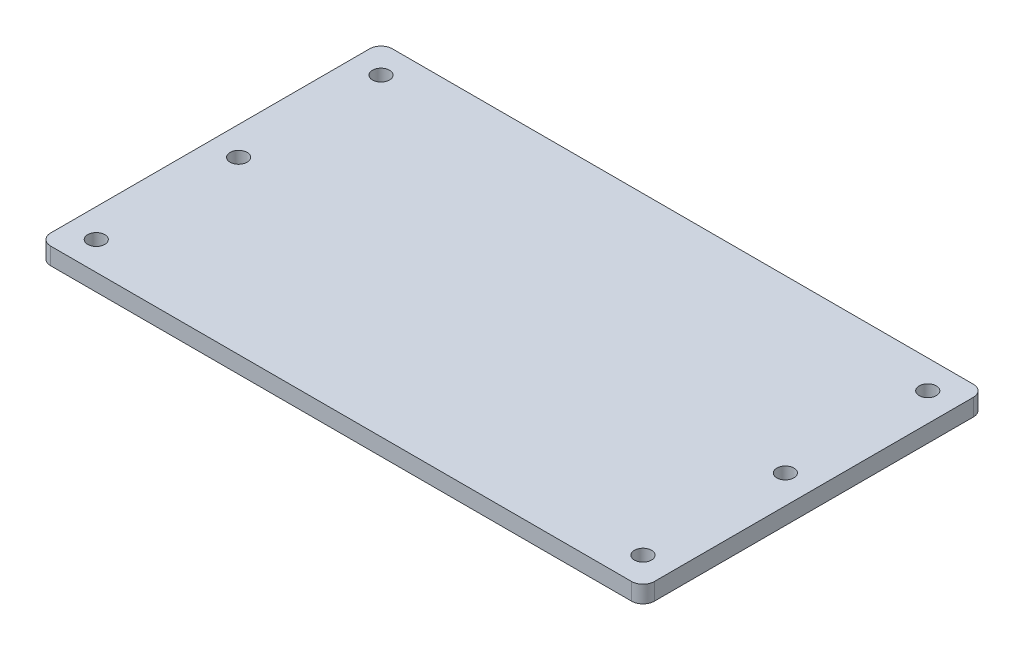
ISO-10303-21;
HEADER;
FILE_DESCRIPTION(('STEP AP214'),'2;1');
FILE_NAME('part.step','',(''),(''),'','','');
FILE_SCHEMA(('AUTOMOTIVE_DESIGN { 1 0 10303 214 1 1 1 1 }'));
ENDSEC;
DATA;
#1=APPLICATION_CONTEXT('core data for automotive mechanical design processes');
#2=APPLICATION_PROTOCOL_DEFINITION('international standard','automotive_design',2000,#1);
#3=PRODUCT_CONTEXT('',#1,'mechanical');
#4=PRODUCT('Part','Part','',(#3));
#5=PRODUCT_RELATED_PRODUCT_CATEGORY('part','',(#4));
#6=PRODUCT_DEFINITION_FORMATION('','',#4);
#7=PRODUCT_DEFINITION_CONTEXT('part definition',#1,'design');
#8=PRODUCT_DEFINITION('design','',#6,#7);
#9=PRODUCT_DEFINITION_SHAPE('','',#8);
#10=(LENGTH_UNIT() NAMED_UNIT(*) SI_UNIT(.MILLI.,.METRE.));
#11=(NAMED_UNIT(*) PLANE_ANGLE_UNIT() SI_UNIT($,.RADIAN.));
#12=(NAMED_UNIT(*) SI_UNIT($,.STERADIAN.) SOLID_ANGLE_UNIT());
#13=UNCERTAINTY_MEASURE_WITH_UNIT(LENGTH_MEASURE(1.E-05),#10,'distance_accuracy_value','');
#14=(GEOMETRIC_REPRESENTATION_CONTEXT(3) GLOBAL_UNCERTAINTY_ASSIGNED_CONTEXT((#13)) GLOBAL_UNIT_ASSIGNED_CONTEXT((#10,
#11,#12)) REPRESENTATION_CONTEXT('',''));
#15=CARTESIAN_POINT('',(0.,0.,0.));
#16=DIRECTION('',(0.,0.,1.));
#17=DIRECTION('',(1.,0.,0.));
#18=AXIS2_PLACEMENT_3D('',#15,#16,#17);
#19=CARTESIAN_POINT('',(53.,3.,-30.));
#20=DIRECTION('',(-1.,0.,0.));
#21=DIRECTION('',(0.,0.,1.));
#22=AXIS2_PLACEMENT_3D('',#19,#20,#21);
#23=PLANE('',#22);
#24=DIRECTION('',(0.,0.,-1.));
#25=VECTOR('',#24,1.);
#26=CARTESIAN_POINT('',(53.,3.,-30.));
#27=LINE('',#26,#25);
#28=CARTESIAN_POINT('',(53.,3.,28.));
#29=VERTEX_POINT('',#28);
#30=CARTESIAN_POINT('',(53.,3.,-28.));
#31=VERTEX_POINT('',#30);
#32=EDGE_CURVE('E134',#29,#31,#27,.T.);
#33=ORIENTED_EDGE('',*,*,#32,.F.);
#34=DIRECTION('',(0.,-1.,0.));
#35=VECTOR('',#34,1.);
#36=CARTESIAN_POINT('',(53.,3.,28.));
#37=LINE('',#36,#35);
#38=CARTESIAN_POINT('',(53.,0.,28.));
#39=VERTEX_POINT('',#38);
#40=EDGE_CURVE('E117',#29,#39,#37,.T.);
#41=ORIENTED_EDGE('',*,*,#40,.T.);
#42=DIRECTION('',(0.,0.,-1.));
#43=VECTOR('',#42,1.);
#44=CARTESIAN_POINT('',(53.,0.,-30.));
#45=LINE('',#44,#43);
#46=CARTESIAN_POINT('',(53.,0.,-28.));
#47=VERTEX_POINT('',#46);
#48=EDGE_CURVE('E128',#39,#47,#45,.T.);
#49=ORIENTED_EDGE('',*,*,#48,.T.);
#50=DIRECTION('',(0.,-1.,0.));
#51=VECTOR('',#50,1.);
#52=CARTESIAN_POINT('',(53.,3.,-28.));
#53=LINE('',#52,#51);
#54=EDGE_CURVE('E136',#47,#31,#53,.F.);
#55=ORIENTED_EDGE('',*,*,#54,.T.);
#56=EDGE_LOOP('',(#33,#41,#49,#55));
#57=FACE_BOUND('',#56,.T.);
#58=ADVANCED_FACE('F44',(#57),#23,.F.);
#59=CARTESIAN_POINT('',(-53.,3.,-30.));
#60=DIRECTION('',(0.,0.,1.));
#61=DIRECTION('',(1.,0.,0.));
#62=AXIS2_PLACEMENT_3D('',#59,#60,#61);
#63=PLANE('',#62);
#64=DIRECTION('',(-1.,0.,0.));
#65=VECTOR('',#64,1.);
#66=CARTESIAN_POINT('',(-53.,3.,-30.));
#67=LINE('',#66,#65);
#68=CARTESIAN_POINT('',(51.,3.,-30.));
#69=VERTEX_POINT('',#68);
#70=CARTESIAN_POINT('',(-51.,3.,-30.));
#71=VERTEX_POINT('',#70);
#72=EDGE_CURVE('E216',#69,#71,#67,.T.);
#73=ORIENTED_EDGE('',*,*,#72,.F.);
#74=DIRECTION('',(0.,-1.,0.));
#75=VECTOR('',#74,1.);
#76=CARTESIAN_POINT('',(51.,3.,-30.));
#77=LINE('',#76,#75);
#78=CARTESIAN_POINT('',(51.,0.,-30.));
#79=VERTEX_POINT('',#78);
#80=EDGE_CURVE('E11',#69,#79,#77,.T.);
#81=ORIENTED_EDGE('',*,*,#80,.T.);
#82=DIRECTION('',(-1.,0.,0.));
#83=VECTOR('',#82,1.);
#84=CARTESIAN_POINT('',(-53.,0.,-30.));
#85=LINE('',#84,#83);
#86=CARTESIAN_POINT('',(-51.,0.,-30.));
#87=VERTEX_POINT('',#86);
#88=EDGE_CURVE('E142',#79,#87,#85,.T.);
#89=ORIENTED_EDGE('',*,*,#88,.T.);
#90=DIRECTION('',(0.,-1.,0.));
#91=VECTOR('',#90,1.);
#92=CARTESIAN_POINT('',(-51.,3.,-30.));
#93=LINE('',#92,#91);
#94=EDGE_CURVE('E53',#87,#71,#93,.F.);
#95=ORIENTED_EDGE('',*,*,#94,.T.);
#96=EDGE_LOOP('',(#73,#81,#89,#95));
#97=FACE_BOUND('',#96,.T.);
#98=ADVANCED_FACE('F214',(#97),#63,.F.);
#99=CARTESIAN_POINT('',(-53.,3.,-30.));
#100=DIRECTION('',(1.,0.,0.));
#101=DIRECTION('',(0.,0.,-1.));
#102=AXIS2_PLACEMENT_3D('',#99,#100,#101);
#103=PLANE('',#102);
#104=DIRECTION('',(0.,0.,1.));
#105=VECTOR('',#104,1.);
#106=CARTESIAN_POINT('',(-53.,0.,-30.));
#107=LINE('',#106,#105);
#108=CARTESIAN_POINT('',(-53.,0.,-28.));
#109=VERTEX_POINT('',#108);
#110=CARTESIAN_POINT('',(-53.,0.,28.));
#111=VERTEX_POINT('',#110);
#112=EDGE_CURVE('E146',#109,#111,#107,.T.);
#113=ORIENTED_EDGE('',*,*,#112,.T.);
#114=DIRECTION('',(0.,-1.,0.));
#115=VECTOR('',#114,1.);
#116=CARTESIAN_POINT('',(-53.,3.,28.));
#117=LINE('',#116,#115);
#118=CARTESIAN_POINT('',(-53.,3.,28.));
#119=VERTEX_POINT('',#118);
#120=EDGE_CURVE('E61',#111,#119,#117,.F.);
#121=ORIENTED_EDGE('',*,*,#120,.T.);
#122=DIRECTION('',(0.,0.,1.));
#123=VECTOR('',#122,1.);
#124=CARTESIAN_POINT('',(-53.,3.,-30.));
#125=LINE('',#124,#123);
#126=CARTESIAN_POINT('',(-53.,3.,-28.));
#127=VERTEX_POINT('',#126);
#128=EDGE_CURVE('E224',#127,#119,#125,.T.);
#129=ORIENTED_EDGE('',*,*,#128,.F.);
#130=DIRECTION('',(0.,-1.,0.));
#131=VECTOR('',#130,1.);
#132=CARTESIAN_POINT('',(-53.,3.,-28.));
#133=LINE('',#132,#131);
#134=EDGE_CURVE('E210',#127,#109,#133,.T.);
#135=ORIENTED_EDGE('',*,*,#134,.T.);
#136=EDGE_LOOP('',(#113,#121,#129,#135));
#137=FACE_BOUND('',#136,.T.);
#138=ADVANCED_FACE('F227',(#137),#103,.F.);
#139=CARTESIAN_POINT('',(-53.,3.,30.));
#140=DIRECTION('',(0.,0.,-1.));
#141=DIRECTION('',(-1.,0.,0.));
#142=AXIS2_PLACEMENT_3D('',#139,#140,#141);
#143=PLANE('',#142);
#144=DIRECTION('',(1.,0.,0.));
#145=VECTOR('',#144,1.);
#146=CARTESIAN_POINT('',(-53.,0.,30.));
#147=LINE('',#146,#145);
#148=CARTESIAN_POINT('',(-51.,0.,30.));
#149=VERTEX_POINT('',#148);
#150=CARTESIAN_POINT('',(51.,0.,30.));
#151=VERTEX_POINT('',#150);
#152=EDGE_CURVE('E159',#149,#151,#147,.T.);
#153=ORIENTED_EDGE('',*,*,#152,.T.);
#154=DIRECTION('',(0.,-1.,0.));
#155=VECTOR('',#154,1.);
#156=CARTESIAN_POINT('',(51.,3.,30.));
#157=LINE('',#156,#155);
#158=CARTESIAN_POINT('',(51.,3.,30.));
#159=VERTEX_POINT('',#158);
#160=EDGE_CURVE('E119',#151,#159,#157,.F.);
#161=ORIENTED_EDGE('',*,*,#160,.T.);
#162=DIRECTION('',(1.,0.,0.));
#163=VECTOR('',#162,1.);
#164=CARTESIAN_POINT('',(-53.,3.,30.));
#165=LINE('',#164,#163);
#166=CARTESIAN_POINT('',(-51.,3.,30.));
#167=VERTEX_POINT('',#166);
#168=EDGE_CURVE('E154',#167,#159,#165,.T.);
#169=ORIENTED_EDGE('',*,*,#168,.F.);
#170=DIRECTION('',(0.,-1.,0.));
#171=VECTOR('',#170,1.);
#172=CARTESIAN_POINT('',(-51.,3.,30.));
#173=LINE('',#172,#171);
#174=EDGE_CURVE('E123',#167,#149,#173,.T.);
#175=ORIENTED_EDGE('',*,*,#174,.T.);
#176=EDGE_LOOP('',(#153,#161,#169,#175));
#177=FACE_BOUND('',#176,.T.);
#178=ADVANCED_FACE('F233',(#177),#143,.F.);
#179=CARTESIAN_POINT('',(0.,3.,0.));
#180=DIRECTION('',(0.,1.,0.));
#181=DIRECTION('',(0.,0.,1.));
#182=AXIS2_PLACEMENT_3D('',#179,#180,#181);
#183=PLANE('',#182);
#184=CARTESIAN_POINT('',(48.,3.,-25.));
#185=DIRECTION('',(0.,1.,0.));
#186=DIRECTION('',(0.,0.,-1.));
#187=AXIS2_PLACEMENT_3D('',#184,#185,#186);
#188=CIRCLE('',#187,1.5);
#189=CARTESIAN_POINT('',(48.,3.,-26.5));
#190=VERTEX_POINT('',#189);
#191=EDGE_CURVE('E245',#190,#190,#188,.T.);
#192=ORIENTED_EDGE('',*,*,#191,.F.);
#193=EDGE_LOOP('',(#192));
#194=FACE_BOUND('',#193,.T.);
#195=CARTESIAN_POINT('',(48.,3.,0.));
#196=DIRECTION('',(0.,1.,0.));
#197=DIRECTION('',(0.,0.,-1.));
#198=AXIS2_PLACEMENT_3D('',#195,#196,#197);
#199=CIRCLE('',#198,1.5);
#200=CARTESIAN_POINT('',(48.,3.,-1.49999999999998));
#201=VERTEX_POINT('',#200);
#202=EDGE_CURVE('E249',#201,#201,#199,.T.);
#203=ORIENTED_EDGE('',*,*,#202,.F.);
#204=EDGE_LOOP('',(#203));
#205=FACE_BOUND('',#204,.T.);
#206=CARTESIAN_POINT('',(48.,3.,25.));
#207=DIRECTION('',(0.,1.,0.));
#208=DIRECTION('',(0.,0.,-1.));
#209=AXIS2_PLACEMENT_3D('',#206,#207,#208);
#210=CIRCLE('',#209,1.50000000000002);
#211=CARTESIAN_POINT('',(48.,3.,23.5));
#212=VERTEX_POINT('',#211);
#213=EDGE_CURVE('E252',#212,#212,#210,.T.);
#214=ORIENTED_EDGE('',*,*,#213,.F.);
#215=EDGE_LOOP('',(#214));
#216=FACE_BOUND('',#215,.T.);
#217=CARTESIAN_POINT('',(-48.,3.,25.));
#218=DIRECTION('',(0.,1.,0.));
#219=DIRECTION('',(0.,0.,1.));
#220=AXIS2_PLACEMENT_3D('',#217,#218,#219);
#221=CIRCLE('',#220,1.5);
#222=CARTESIAN_POINT('',(-48.,3.,26.5));
#223=VERTEX_POINT('',#222);
#224=EDGE_CURVE('E258',#223,#223,#221,.T.);
#225=ORIENTED_EDGE('',*,*,#224,.F.);
#226=EDGE_LOOP('',(#225));
#227=FACE_BOUND('',#226,.T.);
#228=CARTESIAN_POINT('',(-48.,3.,0.));
#229=DIRECTION('',(0.,1.,0.));
#230=DIRECTION('',(0.,0.,1.));
#231=AXIS2_PLACEMENT_3D('',#228,#229,#230);
#232=CIRCLE('',#231,1.5);
#233=CARTESIAN_POINT('',(-48.,3.,1.5));
#234=VERTEX_POINT('',#233);
#235=EDGE_CURVE('E243',#234,#234,#232,.T.);
#236=ORIENTED_EDGE('',*,*,#235,.F.);
#237=EDGE_LOOP('',(#236));
#238=FACE_BOUND('',#237,.T.);
#239=CARTESIAN_POINT('',(-48.,3.,-25.));
#240=DIRECTION('',(0.,1.,0.));
#241=DIRECTION('',(0.,0.,1.));
#242=AXIS2_PLACEMENT_3D('',#239,#240,#241);
#243=CIRCLE('',#242,1.5);
#244=CARTESIAN_POINT('',(-48.,3.,-23.5));
#245=VERTEX_POINT('',#244);
#246=EDGE_CURVE('E169',#245,#245,#243,.T.);
#247=ORIENTED_EDGE('',*,*,#246,.F.);
#248=EDGE_LOOP('',(#247));
#249=FACE_BOUND('',#248,.T.);
#250=ORIENTED_EDGE('',*,*,#168,.T.);
#251=CARTESIAN_POINT('',(51.,3.,28.));
#252=DIRECTION('',(0.,1.,0.));
#253=DIRECTION('',(0.,0.,1.));
#254=AXIS2_PLACEMENT_3D('',#251,#252,#253);
#255=CIRCLE('',#254,2.);
#256=EDGE_CURVE('E204',#159,#29,#255,.T.);
#257=ORIENTED_EDGE('',*,*,#256,.T.);
#258=ORIENTED_EDGE('',*,*,#32,.T.);
#259=CARTESIAN_POINT('',(51.,3.,-28.));
#260=DIRECTION('',(0.,1.,0.));
#261=DIRECTION('',(0.,0.,1.));
#262=AXIS2_PLACEMENT_3D('',#259,#260,#261);
#263=CIRCLE('',#262,2.);
#264=EDGE_CURVE('E196',#31,#69,#263,.T.);
#265=ORIENTED_EDGE('',*,*,#264,.T.);
#266=ORIENTED_EDGE('',*,*,#72,.T.);
#267=CARTESIAN_POINT('',(-51.,3.,-28.));
#268=DIRECTION('',(0.,1.,0.));
#269=DIRECTION('',(0.,0.,1.));
#270=AXIS2_PLACEMENT_3D('',#267,#268,#269);
#271=CIRCLE('',#270,2.);
#272=EDGE_CURVE('E69',#71,#127,#271,.T.);
#273=ORIENTED_EDGE('',*,*,#272,.T.);
#274=ORIENTED_EDGE('',*,*,#128,.T.);
#275=CARTESIAN_POINT('',(-51.,3.,28.));
#276=DIRECTION('',(0.,1.,0.));
#277=DIRECTION('',(0.,0.,1.));
#278=AXIS2_PLACEMENT_3D('',#275,#276,#277);
#279=CIRCLE('',#278,2.);
#280=EDGE_CURVE('E203',#119,#167,#279,.T.);
#281=ORIENTED_EDGE('',*,*,#280,.T.);
#282=EDGE_LOOP('',(#250,#257,#258,#265,#266,#273,#274,#281));
#283=FACE_BOUND('',#282,.T.);
#284=ADVANCED_FACE('F219',(#194,#205,#216,#227,#238,#249,#283),#183,.T.);
#285=CARTESIAN_POINT('',(0.,0.,0.));
#286=DIRECTION('',(0.,1.,0.));
#287=DIRECTION('',(0.,0.,1.));
#288=AXIS2_PLACEMENT_3D('',#285,#286,#287);
#289=PLANE('',#288);
#290=CARTESIAN_POINT('',(48.,0.,-25.));
#291=DIRECTION('',(0.,1.,0.));
#292=DIRECTION('',(0.,0.,1.));
#293=AXIS2_PLACEMENT_3D('',#290,#291,#292);
#294=CIRCLE('',#293,1.5);
#295=CARTESIAN_POINT('',(48.,0.,-23.5));
#296=VERTEX_POINT('',#295);
#297=EDGE_CURVE('E141',#296,#296,#294,.T.);
#298=ORIENTED_EDGE('',*,*,#297,.T.);
#299=EDGE_LOOP('',(#298));
#300=FACE_BOUND('',#299,.T.);
#301=CARTESIAN_POINT('',(48.,0.,0.));
#302=DIRECTION('',(0.,1.,0.));
#303=DIRECTION('',(0.,0.,1.));
#304=AXIS2_PLACEMENT_3D('',#301,#302,#303);
#305=CIRCLE('',#304,1.5);
#306=CARTESIAN_POINT('',(48.,0.,1.50000000000003));
#307=VERTEX_POINT('',#306);
#308=EDGE_CURVE('E155',#307,#307,#305,.T.);
#309=ORIENTED_EDGE('',*,*,#308,.T.);
#310=EDGE_LOOP('',(#309));
#311=FACE_BOUND('',#310,.T.);
#312=CARTESIAN_POINT('',(48.,0.,25.));
#313=DIRECTION('',(0.,1.,0.));
#314=DIRECTION('',(0.,0.,1.));
#315=AXIS2_PLACEMENT_3D('',#312,#313,#314);
#316=CIRCLE('',#315,1.50000000000002);
#317=CARTESIAN_POINT('',(48.,0.,26.5));
#318=VERTEX_POINT('',#317);
#319=EDGE_CURVE('E176',#318,#318,#316,.T.);
#320=ORIENTED_EDGE('',*,*,#319,.T.);
#321=EDGE_LOOP('',(#320));
#322=FACE_BOUND('',#321,.T.);
#323=CARTESIAN_POINT('',(-48.,0.,25.));
#324=DIRECTION('',(0.,1.,0.));
#325=DIRECTION('',(0.,0.,1.));
#326=AXIS2_PLACEMENT_3D('',#323,#324,#325);
#327=CIRCLE('',#326,1.5);
#328=CARTESIAN_POINT('',(-48.,0.,26.5));
#329=VERTEX_POINT('',#328);
#330=EDGE_CURVE('E172',#329,#329,#327,.T.);
#331=ORIENTED_EDGE('',*,*,#330,.T.);
#332=EDGE_LOOP('',(#331));
#333=FACE_BOUND('',#332,.T.);
#334=CARTESIAN_POINT('',(-48.,0.,0.));
#335=DIRECTION('',(0.,1.,0.));
#336=DIRECTION('',(0.,0.,1.));
#337=AXIS2_PLACEMENT_3D('',#334,#335,#336);
#338=CIRCLE('',#337,1.5);
#339=CARTESIAN_POINT('',(-48.,0.,1.5));
#340=VERTEX_POINT('',#339);
#341=EDGE_CURVE('E170',#340,#340,#338,.T.);
#342=ORIENTED_EDGE('',*,*,#341,.T.);
#343=EDGE_LOOP('',(#342));
#344=FACE_BOUND('',#343,.T.);
#345=CARTESIAN_POINT('',(-48.,0.,-25.));
#346=DIRECTION('',(0.,1.,0.));
#347=DIRECTION('',(0.,0.,1.));
#348=AXIS2_PLACEMENT_3D('',#345,#346,#347);
#349=CIRCLE('',#348,1.5);
#350=CARTESIAN_POINT('',(-48.,0.,-23.5));
#351=VERTEX_POINT('',#350);
#352=EDGE_CURVE('E162',#351,#351,#349,.T.);
#353=ORIENTED_EDGE('',*,*,#352,.T.);
#354=EDGE_LOOP('',(#353));
#355=FACE_BOUND('',#354,.T.);
#356=ORIENTED_EDGE('',*,*,#48,.F.);
#357=CARTESIAN_POINT('',(51.,0.,28.));
#358=DIRECTION('',(0.,1.,0.));
#359=DIRECTION('',(0.,0.,1.));
#360=AXIS2_PLACEMENT_3D('',#357,#358,#359);
#361=CIRCLE('',#360,2.);
#362=EDGE_CURVE('E114',#39,#151,#361,.F.);
#363=ORIENTED_EDGE('',*,*,#362,.T.);
#364=ORIENTED_EDGE('',*,*,#152,.F.);
#365=CARTESIAN_POINT('',(-51.,0.,28.));
#366=DIRECTION('',(0.,1.,0.));
#367=DIRECTION('',(0.,0.,1.));
#368=AXIS2_PLACEMENT_3D('',#365,#366,#367);
#369=CIRCLE('',#368,2.);
#370=EDGE_CURVE('E125',#149,#111,#369,.F.);
#371=ORIENTED_EDGE('',*,*,#370,.T.);
#372=ORIENTED_EDGE('',*,*,#112,.F.);
#373=CARTESIAN_POINT('',(-51.,0.,-28.));
#374=DIRECTION('',(0.,1.,0.));
#375=DIRECTION('',(0.,0.,1.));
#376=AXIS2_PLACEMENT_3D('',#373,#374,#375);
#377=CIRCLE('',#376,2.);
#378=EDGE_CURVE('E135',#109,#87,#377,.F.);
#379=ORIENTED_EDGE('',*,*,#378,.T.);
#380=ORIENTED_EDGE('',*,*,#88,.F.);
#381=CARTESIAN_POINT('',(51.,0.,-28.));
#382=DIRECTION('',(0.,1.,0.));
#383=DIRECTION('',(0.,0.,1.));
#384=AXIS2_PLACEMENT_3D('',#381,#382,#383);
#385=CIRCLE('',#384,2.);
#386=EDGE_CURVE('E140',#79,#47,#385,.F.);
#387=ORIENTED_EDGE('',*,*,#386,.T.);
#388=EDGE_LOOP('',(#356,#363,#364,#371,#372,#379,#380,#387));
#389=FACE_BOUND('',#388,.T.);
#390=ADVANCED_FACE('F139',(#300,#311,#322,#333,#344,#355,#389),#289,.F.);
#391=CARTESIAN_POINT('',(-48.,-7.,-25.));
#392=DIRECTION('',(0.,1.,0.));
#393=DIRECTION('',(0.,0.,1.));
#394=AXIS2_PLACEMENT_3D('',#391,#392,#393);
#395=CYLINDRICAL_SURFACE('',#394,1.5);
#396=ORIENTED_EDGE('',*,*,#246,.T.);
#397=EDGE_LOOP('',(#396));
#398=FACE_BOUND('',#397,.T.);
#399=ORIENTED_EDGE('',*,*,#352,.F.);
#400=EDGE_LOOP('',(#399));
#401=FACE_BOUND('',#400,.T.);
#402=ADVANCED_FACE('F272',(#398,#401),#395,.F.);
#403=CARTESIAN_POINT('',(-48.,-7.,0.));
#404=DIRECTION('',(0.,1.,0.));
#405=DIRECTION('',(0.,0.,1.));
#406=AXIS2_PLACEMENT_3D('',#403,#404,#405);
#407=CYLINDRICAL_SURFACE('',#406,1.5);
#408=ORIENTED_EDGE('',*,*,#235,.T.);
#409=EDGE_LOOP('',(#408));
#410=FACE_BOUND('',#409,.T.);
#411=ORIENTED_EDGE('',*,*,#341,.F.);
#412=EDGE_LOOP('',(#411));
#413=FACE_BOUND('',#412,.T.);
#414=ADVANCED_FACE('F262',(#410,#413),#407,.F.);
#415=CARTESIAN_POINT('',(-48.,-7.,25.));
#416=DIRECTION('',(0.,1.,0.));
#417=DIRECTION('',(0.,0.,1.));
#418=AXIS2_PLACEMENT_3D('',#415,#416,#417);
#419=CYLINDRICAL_SURFACE('',#418,1.5);
#420=ORIENTED_EDGE('',*,*,#224,.T.);
#421=EDGE_LOOP('',(#420));
#422=FACE_BOUND('',#421,.T.);
#423=ORIENTED_EDGE('',*,*,#330,.F.);
#424=EDGE_LOOP('',(#423));
#425=FACE_BOUND('',#424,.T.);
#426=ADVANCED_FACE('F387',(#422,#425),#419,.F.);
#427=CARTESIAN_POINT('',(48.,-7.,25.));
#428=DIRECTION('',(0.,1.,0.));
#429=DIRECTION('',(0.,0.,1.));
#430=AXIS2_PLACEMENT_3D('',#427,#428,#429);
#431=CYLINDRICAL_SURFACE('',#430,1.50000000000002);
#432=ORIENTED_EDGE('',*,*,#213,.T.);
#433=EDGE_LOOP('',(#432));
#434=FACE_BOUND('',#433,.T.);
#435=ORIENTED_EDGE('',*,*,#319,.F.);
#436=EDGE_LOOP('',(#435));
#437=FACE_BOUND('',#436,.T.);
#438=ADVANCED_FACE('F376',(#434,#437),#431,.F.);
#439=CARTESIAN_POINT('',(48.,-7.,0.));
#440=DIRECTION('',(0.,1.,0.));
#441=DIRECTION('',(0.,0.,1.));
#442=AXIS2_PLACEMENT_3D('',#439,#440,#441);
#443=CYLINDRICAL_SURFACE('',#442,1.5);
#444=ORIENTED_EDGE('',*,*,#202,.T.);
#445=EDGE_LOOP('',(#444));
#446=FACE_BOUND('',#445,.T.);
#447=ORIENTED_EDGE('',*,*,#308,.F.);
#448=EDGE_LOOP('',(#447));
#449=FACE_BOUND('',#448,.T.);
#450=ADVANCED_FACE('F368',(#446,#449),#443,.F.);
#451=CARTESIAN_POINT('',(48.,-7.,-25.));
#452=DIRECTION('',(0.,1.,0.));
#453=DIRECTION('',(0.,0.,1.));
#454=AXIS2_PLACEMENT_3D('',#451,#452,#453);
#455=CYLINDRICAL_SURFACE('',#454,1.5);
#456=ORIENTED_EDGE('',*,*,#191,.T.);
#457=EDGE_LOOP('',(#456));
#458=FACE_BOUND('',#457,.T.);
#459=ORIENTED_EDGE('',*,*,#297,.F.);
#460=EDGE_LOOP('',(#459));
#461=FACE_BOUND('',#460,.T.);
#462=ADVANCED_FACE('F294',(#458,#461),#455,.F.);
#463=CARTESIAN_POINT('',(51.,3.,28.));
#464=DIRECTION('',(0.,-1.,0.));
#465=DIRECTION('',(0.,0.,-1.));
#466=AXIS2_PLACEMENT_3D('',#463,#464,#465);
#467=CYLINDRICAL_SURFACE('',#466,2.);
#468=ORIENTED_EDGE('',*,*,#256,.F.);
#469=ORIENTED_EDGE('',*,*,#160,.F.);
#470=ORIENTED_EDGE('',*,*,#362,.F.);
#471=ORIENTED_EDGE('',*,*,#40,.F.);
#472=EDGE_LOOP('',(#468,#469,#470,#471));
#473=FACE_BOUND('',#472,.T.);
#474=ADVANCED_FACE('F116',(#473),#467,.T.);
#475=CARTESIAN_POINT('',(-51.,3.,28.));
#476=DIRECTION('',(0.,-1.,0.));
#477=DIRECTION('',(0.,0.,-1.));
#478=AXIS2_PLACEMENT_3D('',#475,#476,#477);
#479=CYLINDRICAL_SURFACE('',#478,2.);
#480=ORIENTED_EDGE('',*,*,#280,.F.);
#481=ORIENTED_EDGE('',*,*,#120,.F.);
#482=ORIENTED_EDGE('',*,*,#370,.F.);
#483=ORIENTED_EDGE('',*,*,#174,.F.);
#484=EDGE_LOOP('',(#480,#481,#482,#483));
#485=FACE_BOUND('',#484,.T.);
#486=ADVANCED_FACE('F231',(#485),#479,.T.);
#487=CARTESIAN_POINT('',(51.,3.,-28.));
#488=DIRECTION('',(0.,-1.,0.));
#489=DIRECTION('',(0.,0.,-1.));
#490=AXIS2_PLACEMENT_3D('',#487,#488,#489);
#491=CYLINDRICAL_SURFACE('',#490,2.);
#492=ORIENTED_EDGE('',*,*,#264,.F.);
#493=ORIENTED_EDGE('',*,*,#54,.F.);
#494=ORIENTED_EDGE('',*,*,#386,.F.);
#495=ORIENTED_EDGE('',*,*,#80,.F.);
#496=EDGE_LOOP('',(#492,#493,#494,#495));
#497=FACE_BOUND('',#496,.T.);
#498=ADVANCED_FACE('F296',(#497),#491,.T.);
#499=CARTESIAN_POINT('',(-51.,3.,-28.));
#500=DIRECTION('',(0.,-1.,0.));
#501=DIRECTION('',(0.,0.,-1.));
#502=AXIS2_PLACEMENT_3D('',#499,#500,#501);
#503=CYLINDRICAL_SURFACE('',#502,2.);
#504=ORIENTED_EDGE('',*,*,#272,.F.);
#505=ORIENTED_EDGE('',*,*,#94,.F.);
#506=ORIENTED_EDGE('',*,*,#378,.F.);
#507=ORIENTED_EDGE('',*,*,#134,.F.);
#508=EDGE_LOOP('',(#504,#505,#506,#507));
#509=FACE_BOUND('',#508,.T.);
#510=ADVANCED_FACE('F50',(#509),#503,.T.);
#511=CLOSED_SHELL('',(#58,#98,#138,#178,#284,#390,#402,#414,#426,#438,#450,#462,#474,#486,#498,#510));
#512=MANIFOLD_SOLID_BREP('B2',#511);
#513=ADVANCED_BREP_SHAPE_REPRESENTATION('',(#18,#512),#14);
#514=SHAPE_DEFINITION_REPRESENTATION(#9,#513);
ENDSEC;
END-ISO-10303-21;
